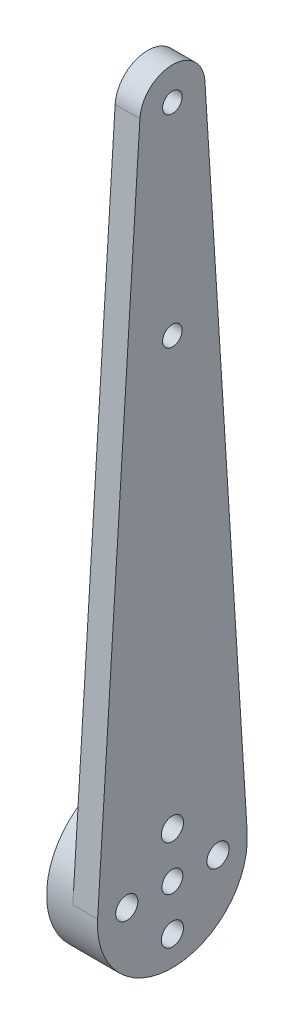
ISO-10303-21;
HEADER;
FILE_DESCRIPTION(('STEP AP214'),'2;1');
FILE_NAME('part.step','',(''),(''),'','','');
FILE_SCHEMA(('AUTOMOTIVE_DESIGN { 1 0 10303 214 1 1 1 1 }'));
ENDSEC;
DATA;
#1=APPLICATION_CONTEXT('core data for automotive mechanical design processes');
#2=APPLICATION_PROTOCOL_DEFINITION('international standard','automotive_design',2000,#1);
#3=PRODUCT_CONTEXT('',#1,'mechanical');
#4=PRODUCT('Part','Part','',(#3));
#5=PRODUCT_RELATED_PRODUCT_CATEGORY('part','',(#4));
#6=PRODUCT_DEFINITION_FORMATION('','',#4);
#7=PRODUCT_DEFINITION_CONTEXT('part definition',#1,'design');
#8=PRODUCT_DEFINITION('design','',#6,#7);
#9=PRODUCT_DEFINITION_SHAPE('','',#8);
#10=(LENGTH_UNIT() NAMED_UNIT(*) SI_UNIT(.MILLI.,.METRE.));
#11=(NAMED_UNIT(*) PLANE_ANGLE_UNIT() SI_UNIT($,.RADIAN.));
#12=(NAMED_UNIT(*) SI_UNIT($,.STERADIAN.) SOLID_ANGLE_UNIT());
#13=UNCERTAINTY_MEASURE_WITH_UNIT(LENGTH_MEASURE(1.E-05),#10,'distance_accuracy_value','');
#14=(GEOMETRIC_REPRESENTATION_CONTEXT(3) GLOBAL_UNCERTAINTY_ASSIGNED_CONTEXT((#13)) GLOBAL_UNIT_ASSIGNED_CONTEXT((#10,
#11,#12)) REPRESENTATION_CONTEXT('',''));
#15=CARTESIAN_POINT('',(0.,0.,0.));
#16=DIRECTION('',(0.,0.,1.));
#17=DIRECTION('',(1.,0.,0.));
#18=AXIS2_PLACEMENT_3D('',#15,#16,#17);
#19=CARTESIAN_POINT('',(3.80000000000004,0.,0.));
#20=DIRECTION('',(1.,0.,0.));
#21=DIRECTION('',(0.,1.,0.));
#22=AXIS2_PLACEMENT_3D('',#19,#20,#21);
#23=PLANE('',#22);
#24=CARTESIAN_POINT('',(3.8,72.5,0.));
#25=DIRECTION('',(1.,0.,0.));
#26=DIRECTION('',(0.,1.,0.));
#27=AXIS2_PLACEMENT_3D('',#24,#25,#26);
#28=CIRCLE('',#27,1.5);
#29=CARTESIAN_POINT('',(3.8,74.,0.));
#30=VERTEX_POINT('',#29);
#31=EDGE_CURVE('E38',#30,#30,#28,.T.);
#32=ORIENTED_EDGE('',*,*,#31,.F.);
#33=EDGE_LOOP('',(#32));
#34=FACE_BOUND('',#33,.T.);
#35=DIRECTION('',(0.,0.998026010327863,-0.0628019323671498));
#36=VECTOR('',#35,1.);
#37=CARTESIAN_POINT('',(3.80000000000004,0.722222222222215,11.4772991187704));
#38=LINE('',#37,#36);
#39=CARTESIAN_POINT('',(3.80000000000004,0.722222222222222,11.4772991187704));
#40=VERTEX_POINT('',#39);
#41=CARTESIAN_POINT('',(3.79999999999998,103.814009661836,4.99013005163932));
#42=VERTEX_POINT('',#41);
#43=EDGE_CURVE('E92',#40,#42,#38,.T.);
#44=ORIENTED_EDGE('',*,*,#43,.F.);
#45=CARTESIAN_POINT('',(3.80000000000004,0.,0.));
#46=DIRECTION('',(1.,0.,0.));
#47=DIRECTION('',(0.,1.,0.));
#48=AXIS2_PLACEMENT_3D('',#45,#46,#47);
#49=CIRCLE('',#48,11.5);
#50=CARTESIAN_POINT('',(3.80000000000002,0.722222222222222,-11.4772991187704));
#51=VERTEX_POINT('',#50);
#52=EDGE_CURVE('E85',#40,#51,#49,.T.);
#53=ORIENTED_EDGE('',*,*,#52,.T.);
#54=DIRECTION('',(0.,-0.998026010327863,-0.0628019323671498));
#55=VECTOR('',#54,1.);
#56=CARTESIAN_POINT('',(3.80000000000004,0.722222222222215,-11.4772991187704));
#57=LINE('',#56,#55);
#58=CARTESIAN_POINT('',(3.79999999999998,103.814009661836,-4.99013005163931));
#59=VERTEX_POINT('',#58);
#60=EDGE_CURVE('E43',#59,#51,#57,.T.);
#61=ORIENTED_EDGE('',*,*,#60,.F.);
#62=CARTESIAN_POINT('',(3.79999999999998,103.5,0.));
#63=DIRECTION('',(-1.,0.,0.));
#64=DIRECTION('',(0.,-1.,0.));
#65=AXIS2_PLACEMENT_3D('',#62,#63,#64);
#66=CIRCLE('',#65,5.);
#67=EDGE_CURVE('E51',#42,#59,#66,.T.);
#68=ORIENTED_EDGE('',*,*,#67,.F.);
#69=EDGE_LOOP('',(#44,#53,#61,#68));
#70=FACE_BOUND('',#69,.T.);
#71=CARTESIAN_POINT('',(3.80000000000004,7.,0.));
#72=DIRECTION('',(1.,0.,0.));
#73=DIRECTION('',(0.,1.,0.));
#74=AXIS2_PLACEMENT_3D('',#71,#72,#73);
#75=CIRCLE('',#74,1.7);
#76=CARTESIAN_POINT('',(3.80000000000004,8.7,0.));
#77=VERTEX_POINT('',#76);
#78=EDGE_CURVE('E95',#77,#77,#75,.F.);
#79=ORIENTED_EDGE('',*,*,#78,.T.);
#80=EDGE_LOOP('',(#79));
#81=FACE_BOUND('',#80,.T.);
#82=CARTESIAN_POINT('',(3.80000000000005,-7.,0.));
#83=DIRECTION('',(1.,0.,0.));
#84=DIRECTION('',(0.,1.,0.));
#85=AXIS2_PLACEMENT_3D('',#82,#83,#84);
#86=CIRCLE('',#85,1.7);
#87=CARTESIAN_POINT('',(3.80000000000005,-5.3,0.));
#88=VERTEX_POINT('',#87);
#89=EDGE_CURVE('E106',#88,#88,#86,.F.);
#90=ORIENTED_EDGE('',*,*,#89,.T.);
#91=EDGE_LOOP('',(#90));
#92=FACE_BOUND('',#91,.T.);
#93=CARTESIAN_POINT('',(3.80000000000004,0.,7.));
#94=DIRECTION('',(1.,0.,0.));
#95=DIRECTION('',(0.,1.,0.));
#96=AXIS2_PLACEMENT_3D('',#93,#94,#95);
#97=CIRCLE('',#96,1.7);
#98=CARTESIAN_POINT('',(3.80000000000004,1.69999999999997,7.));
#99=VERTEX_POINT('',#98);
#100=EDGE_CURVE('E109',#99,#99,#97,.F.);
#101=ORIENTED_EDGE('',*,*,#100,.T.);
#102=EDGE_LOOP('',(#101));
#103=FACE_BOUND('',#102,.T.);
#104=CARTESIAN_POINT('',(3.80000000000004,0.,-7.));
#105=DIRECTION('',(1.,0.,0.));
#106=DIRECTION('',(0.,1.,0.));
#107=AXIS2_PLACEMENT_3D('',#104,#105,#106);
#108=CIRCLE('',#107,1.7);
#109=CARTESIAN_POINT('',(3.80000000000004,1.70000000000007,-7.));
#110=VERTEX_POINT('',#109);
#111=EDGE_CURVE('E101',#110,#110,#108,.F.);
#112=ORIENTED_EDGE('',*,*,#111,.T.);
#113=EDGE_LOOP('',(#112));
#114=FACE_BOUND('',#113,.T.);
#115=CARTESIAN_POINT('',(3.80000000000004,0.,0.));
#116=DIRECTION('',(1.,0.,0.));
#117=DIRECTION('',(0.,1.,0.));
#118=AXIS2_PLACEMENT_3D('',#115,#116,#117);
#119=CIRCLE('',#118,1.6);
#120=CARTESIAN_POINT('',(3.80000000000004,1.6,0.));
#121=VERTEX_POINT('',#120);
#122=EDGE_CURVE('E94',#121,#121,#119,.T.);
#123=ORIENTED_EDGE('',*,*,#122,.F.);
#124=EDGE_LOOP('',(#123));
#125=FACE_BOUND('',#124,.T.);
#126=CARTESIAN_POINT('',(3.79999999999998,103.5,0.));
#127=DIRECTION('',(-1.,0.,0.));
#128=DIRECTION('',(0.,-1.,0.));
#129=AXIS2_PLACEMENT_3D('',#126,#127,#128);
#130=CIRCLE('',#129,1.5);
#131=CARTESIAN_POINT('',(3.79999999999998,102.,0.));
#132=VERTEX_POINT('',#131);
#133=EDGE_CURVE('E11',#132,#132,#130,.T.);
#134=ORIENTED_EDGE('',*,*,#133,.T.);
#135=EDGE_LOOP('',(#134));
#136=FACE_BOUND('',#135,.T.);
#137=ADVANCED_FACE('F34',(#34,#70,#81,#92,#103,#114,#125,#136),#23,.T.);
#138=CARTESIAN_POINT('',(16.,0.,0.));
#139=DIRECTION('',(-1.,0.,0.));
#140=DIRECTION('',(0.,0.,1.));
#141=AXIS2_PLACEMENT_3D('',#138,#139,#140);
#142=CYLINDRICAL_SURFACE('',#141,1.6);
#143=CARTESIAN_POINT('',(-2.,0.,0.));
#144=DIRECTION('',(1.,0.,0.));
#145=DIRECTION('',(0.,0.,-1.));
#146=AXIS2_PLACEMENT_3D('',#143,#144,#145);
#147=CIRCLE('',#146,1.6);
#148=CARTESIAN_POINT('',(-2.,0.,-1.6));
#149=VERTEX_POINT('',#148);
#150=EDGE_CURVE('E132',#149,#149,#147,.T.);
#151=ORIENTED_EDGE('',*,*,#150,.F.);
#152=EDGE_LOOP('',(#151));
#153=FACE_BOUND('',#152,.T.);
#154=ORIENTED_EDGE('',*,*,#122,.T.);
#155=EDGE_LOOP('',(#154));
#156=FACE_BOUND('',#155,.T.);
#157=ADVANCED_FACE('F36',(#153,#156),#142,.F.);
#158=CARTESIAN_POINT('',(16.,0.722222222222222,11.4772991187704));
#159=DIRECTION('',(0.,-0.0628019323671498,-0.998026010327863));
#160=DIRECTION('',(0.,0.998026010327863,-0.0628019323671498));
#161=AXIS2_PLACEMENT_3D('',#158,#159,#160);
#162=PLANE('',#161);
#163=DIRECTION('',(-1.,0.,0.));
#164=VECTOR('',#163,1.);
#165=CARTESIAN_POINT('',(16.,0.722222222222222,11.4772991187704));
#166=LINE('',#165,#164);
#167=CARTESIAN_POINT('',(0.,0.722222222222222,11.4772991187704));
#168=VERTEX_POINT('',#167);
#169=EDGE_CURVE('E89',#40,#168,#166,.T.);
#170=ORIENTED_EDGE('',*,*,#169,.F.);
#171=ORIENTED_EDGE('',*,*,#43,.T.);
#172=DIRECTION('',(-1.,0.,0.));
#173=VECTOR('',#172,1.);
#174=CARTESIAN_POINT('',(16.,103.814009661836,4.99013005163932));
#175=LINE('',#174,#173);
#176=CARTESIAN_POINT('',(0.,103.814009661836,4.99013005163932));
#177=VERTEX_POINT('',#176);
#178=EDGE_CURVE('E113',#42,#177,#175,.T.);
#179=ORIENTED_EDGE('',*,*,#178,.T.);
#180=DIRECTION('',(0.,-0.998026010327863,0.0628019323671498));
#181=VECTOR('',#180,1.);
#182=CARTESIAN_POINT('',(0.,0.722222222222222,11.4772991187704));
#183=LINE('',#182,#181);
#184=EDGE_CURVE('E117',#177,#168,#183,.T.);
#185=ORIENTED_EDGE('',*,*,#184,.T.);
#186=EDGE_LOOP('',(#170,#171,#179,#185));
#187=FACE_BOUND('',#186,.T.);
#188=ADVANCED_FACE('F152',(#187),#162,.F.);
#189=CARTESIAN_POINT('',(16.,0.,0.));
#190=DIRECTION('',(-1.,0.,0.));
#191=DIRECTION('',(0.,0.,1.));
#192=AXIS2_PLACEMENT_3D('',#189,#190,#191);
#193=CYLINDRICAL_SURFACE('',#192,11.5);
#194=CARTESIAN_POINT('',(-4.,0.,0.));
#195=DIRECTION('',(1.,0.,0.));
#196=DIRECTION('',(0.,0.,-1.));
#197=AXIS2_PLACEMENT_3D('',#194,#195,#196);
#198=CIRCLE('',#197,11.5);
#199=CARTESIAN_POINT('',(-4.,0.,-11.5));
#200=VERTEX_POINT('',#199);
#201=EDGE_CURVE('E130',#200,#200,#198,.T.);
#202=ORIENTED_EDGE('',*,*,#201,.T.);
#203=EDGE_LOOP('',(#202));
#204=FACE_BOUND('',#203,.T.);
#205=ORIENTED_EDGE('',*,*,#52,.F.);
#206=ORIENTED_EDGE('',*,*,#169,.T.);
#207=CARTESIAN_POINT('',(0.,0.,0.));
#208=DIRECTION('',(1.,0.,0.));
#209=DIRECTION('',(0.,0.,-1.));
#210=AXIS2_PLACEMENT_3D('',#207,#208,#209);
#211=CIRCLE('',#210,11.5);
#212=CARTESIAN_POINT('',(0.,0.722222222222222,-11.4772991187704));
#213=VERTEX_POINT('',#212);
#214=EDGE_CURVE('E87',#213,#168,#211,.T.);
#215=ORIENTED_EDGE('',*,*,#214,.F.);
#216=DIRECTION('',(-1.,0.,0.));
#217=VECTOR('',#216,1.);
#218=CARTESIAN_POINT('',(16.,0.722222222222222,-11.4772991187704));
#219=LINE('',#218,#217);
#220=EDGE_CURVE('E77',#51,#213,#219,.T.);
#221=ORIENTED_EDGE('',*,*,#220,.F.);
#222=EDGE_LOOP('',(#205,#206,#215,#221));
#223=FACE_BOUND('',#222,.T.);
#224=ADVANCED_FACE('F84',(#204,#223),#193,.T.);
#225=CARTESIAN_POINT('',(16.,0.722222222222222,-11.4772991187704));
#226=DIRECTION('',(0.,-0.0628019323671497,0.998026010327863));
#227=DIRECTION('',(0.,-0.998026010327863,-0.0628019323671498));
#228=AXIS2_PLACEMENT_3D('',#225,#226,#227);
#229=PLANE('',#228);
#230=ORIENTED_EDGE('',*,*,#60,.T.);
#231=ORIENTED_EDGE('',*,*,#220,.T.);
#232=DIRECTION('',(0.,0.998026010327863,0.0628019323671498));
#233=VECTOR('',#232,1.);
#234=CARTESIAN_POINT('',(0.,0.722222222222222,-11.4772991187704));
#235=LINE('',#234,#233);
#236=CARTESIAN_POINT('',(0.,103.814009661836,-4.99013005163932));
#237=VERTEX_POINT('',#236);
#238=EDGE_CURVE('E115',#213,#237,#235,.T.);
#239=ORIENTED_EDGE('',*,*,#238,.T.);
#240=DIRECTION('',(-1.,0.,0.));
#241=VECTOR('',#240,1.);
#242=CARTESIAN_POINT('',(16.,103.814009661836,-4.99013005163932));
#243=LINE('',#242,#241);
#244=EDGE_CURVE('E79',#59,#237,#243,.T.);
#245=ORIENTED_EDGE('',*,*,#244,.F.);
#246=EDGE_LOOP('',(#230,#231,#239,#245));
#247=FACE_BOUND('',#246,.T.);
#248=ADVANCED_FACE('F75',(#247),#229,.F.);
#249=CARTESIAN_POINT('',(16.,7.,0.));
#250=DIRECTION('',(1.,0.,0.));
#251=DIRECTION('',(0.,0.,-1.));
#252=AXIS2_PLACEMENT_3D('',#249,#250,#251);
#253=CYLINDRICAL_SURFACE('',#252,1.7);
#254=CARTESIAN_POINT('',(-2.,7.,0.));
#255=DIRECTION('',(1.,0.,0.));
#256=DIRECTION('',(0.,0.,-1.));
#257=AXIS2_PLACEMENT_3D('',#254,#255,#256);
#258=CIRCLE('',#257,1.7);
#259=CARTESIAN_POINT('',(-2.,7.,-1.7));
#260=VERTEX_POINT('',#259);
#261=EDGE_CURVE('E140',#260,#260,#258,.T.);
#262=ORIENTED_EDGE('',*,*,#261,.F.);
#263=EDGE_LOOP('',(#262));
#264=FACE_BOUND('',#263,.T.);
#265=ORIENTED_EDGE('',*,*,#78,.F.);
#266=EDGE_LOOP('',(#265));
#267=FACE_BOUND('',#266,.T.);
#268=ADVANCED_FACE('F207',(#264,#267),#253,.F.);
#269=CARTESIAN_POINT('',(16.,0.,-7.));
#270=DIRECTION('',(1.,0.,0.));
#271=DIRECTION('',(0.,-1.,0.));
#272=AXIS2_PLACEMENT_3D('',#269,#270,#271);
#273=CYLINDRICAL_SURFACE('',#272,1.7);
#274=CARTESIAN_POINT('',(-2.,0.,-7.));
#275=DIRECTION('',(1.,0.,0.));
#276=DIRECTION('',(0.,-1.,0.));
#277=AXIS2_PLACEMENT_3D('',#274,#275,#276);
#278=CIRCLE('',#277,1.7);
#279=CARTESIAN_POINT('',(-2.,-1.69999999999992,-7.00000000000002));
#280=VERTEX_POINT('',#279);
#281=EDGE_CURVE('E141',#280,#280,#278,.T.);
#282=ORIENTED_EDGE('',*,*,#281,.F.);
#283=EDGE_LOOP('',(#282));
#284=FACE_BOUND('',#283,.T.);
#285=ORIENTED_EDGE('',*,*,#111,.F.);
#286=EDGE_LOOP('',(#285));
#287=FACE_BOUND('',#286,.T.);
#288=ADVANCED_FACE('F211',(#284,#287),#273,.F.);
#289=CARTESIAN_POINT('',(16.,-7.,0.));
#290=DIRECTION('',(1.,0.,0.));
#291=DIRECTION('',(0.,0.,1.));
#292=AXIS2_PLACEMENT_3D('',#289,#290,#291);
#293=CYLINDRICAL_SURFACE('',#292,1.7);
#294=CARTESIAN_POINT('',(-2.,-7.,0.));
#295=DIRECTION('',(1.,0.,0.));
#296=DIRECTION('',(0.,0.,1.));
#297=AXIS2_PLACEMENT_3D('',#294,#295,#296);
#298=CIRCLE('',#297,1.7);
#299=CARTESIAN_POINT('',(-2.,-7.,1.7));
#300=VERTEX_POINT('',#299);
#301=EDGE_CURVE('E144',#300,#300,#298,.T.);
#302=ORIENTED_EDGE('',*,*,#301,.F.);
#303=EDGE_LOOP('',(#302));
#304=FACE_BOUND('',#303,.T.);
#305=ORIENTED_EDGE('',*,*,#89,.F.);
#306=EDGE_LOOP('',(#305));
#307=FACE_BOUND('',#306,.T.);
#308=ADVANCED_FACE('F217',(#304,#307),#293,.F.);
#309=CARTESIAN_POINT('',(16.,0.,7.));
#310=DIRECTION('',(1.,0.,0.));
#311=DIRECTION('',(0.,1.,0.));
#312=AXIS2_PLACEMENT_3D('',#309,#310,#311);
#313=CYLINDRICAL_SURFACE('',#312,1.7);
#314=CARTESIAN_POINT('',(-2.,0.,7.));
#315=DIRECTION('',(1.,0.,0.));
#316=DIRECTION('',(0.,1.,0.));
#317=AXIS2_PLACEMENT_3D('',#314,#315,#316);
#318=CIRCLE('',#317,1.7);
#319=CARTESIAN_POINT('',(-2.,1.69999999999997,7.00000000000001));
#320=VERTEX_POINT('',#319);
#321=EDGE_CURVE('E147',#320,#320,#318,.T.);
#322=ORIENTED_EDGE('',*,*,#321,.F.);
#323=EDGE_LOOP('',(#322));
#324=FACE_BOUND('',#323,.T.);
#325=ORIENTED_EDGE('',*,*,#100,.F.);
#326=EDGE_LOOP('',(#325));
#327=FACE_BOUND('',#326,.T.);
#328=ADVANCED_FACE('F198',(#324,#327),#313,.F.);
#329=CARTESIAN_POINT('',(16.,103.5,0.));
#330=DIRECTION('',(-1.,0.,0.));
#331=DIRECTION('',(0.,0.,1.));
#332=AXIS2_PLACEMENT_3D('',#329,#330,#331);
#333=CYLINDRICAL_SURFACE('',#332,5.);
#334=ORIENTED_EDGE('',*,*,#67,.T.);
#335=ORIENTED_EDGE('',*,*,#244,.T.);
#336=CARTESIAN_POINT('',(0.,103.5,0.));
#337=DIRECTION('',(1.,0.,0.));
#338=DIRECTION('',(0.,0.,-1.));
#339=AXIS2_PLACEMENT_3D('',#336,#337,#338);
#340=CIRCLE('',#339,5.);
#341=EDGE_CURVE('E121',#237,#177,#340,.T.);
#342=ORIENTED_EDGE('',*,*,#341,.T.);
#343=ORIENTED_EDGE('',*,*,#178,.F.);
#344=EDGE_LOOP('',(#334,#335,#342,#343));
#345=FACE_BOUND('',#344,.T.);
#346=ADVANCED_FACE('F154',(#345),#333,.T.);
#347=CARTESIAN_POINT('',(16.,103.5,0.));
#348=DIRECTION('',(-1.,0.,0.));
#349=DIRECTION('',(0.,0.,1.));
#350=AXIS2_PLACEMENT_3D('',#347,#348,#349);
#351=CYLINDRICAL_SURFACE('',#350,1.5);
#352=ORIENTED_EDGE('',*,*,#133,.F.);
#353=EDGE_LOOP('',(#352));
#354=FACE_BOUND('',#353,.T.);
#355=CARTESIAN_POINT('',(0.,103.5,0.));
#356=DIRECTION('',(1.,0.,0.));
#357=DIRECTION('',(0.,0.,-1.));
#358=AXIS2_PLACEMENT_3D('',#355,#356,#357);
#359=CIRCLE('',#358,1.5);
#360=CARTESIAN_POINT('',(0.,103.5,-1.5));
#361=VERTEX_POINT('',#360);
#362=EDGE_CURVE('E127',#361,#361,#359,.T.);
#363=ORIENTED_EDGE('',*,*,#362,.F.);
#364=EDGE_LOOP('',(#363));
#365=FACE_BOUND('',#364,.T.);
#366=ADVANCED_FACE('F169',(#354,#365),#351,.F.);
#367=CARTESIAN_POINT('',(-4.,0.,0.));
#368=DIRECTION('',(1.,0.,0.));
#369=DIRECTION('',(0.,0.,-1.));
#370=AXIS2_PLACEMENT_3D('',#367,#368,#369);
#371=CYLINDRICAL_SURFACE('',#370,10.25);
#372=CARTESIAN_POINT('',(-4.,0.,0.));
#373=DIRECTION('',(1.,0.,0.));
#374=DIRECTION('',(0.,0.,-1.));
#375=AXIS2_PLACEMENT_3D('',#372,#373,#374);
#376=CIRCLE('',#375,10.25);
#377=CARTESIAN_POINT('',(-4.,0.,-10.25));
#378=VERTEX_POINT('',#377);
#379=EDGE_CURVE('E133',#378,#378,#376,.T.);
#380=ORIENTED_EDGE('',*,*,#379,.F.);
#381=EDGE_LOOP('',(#380));
#382=FACE_BOUND('',#381,.T.);
#383=CARTESIAN_POINT('',(-2.,0.,0.));
#384=DIRECTION('',(1.,0.,0.));
#385=DIRECTION('',(0.,0.,-1.));
#386=AXIS2_PLACEMENT_3D('',#383,#384,#385);
#387=CIRCLE('',#386,10.25);
#388=CARTESIAN_POINT('',(-2.,0.,-10.25));
#389=VERTEX_POINT('',#388);
#390=EDGE_CURVE('E98',#389,#389,#387,.F.);
#391=ORIENTED_EDGE('',*,*,#390,.F.);
#392=EDGE_LOOP('',(#391));
#393=FACE_BOUND('',#392,.T.);
#394=ADVANCED_FACE('F159',(#382,#393),#371,.F.);
#395=CARTESIAN_POINT('',(0.,0.,0.));
#396=DIRECTION('',(1.,0.,0.));
#397=DIRECTION('',(0.,0.,-1.));
#398=AXIS2_PLACEMENT_3D('',#395,#396,#397);
#399=PLANE('',#398);
#400=CARTESIAN_POINT('',(0.,72.5,0.));
#401=DIRECTION('',(1.,0.,0.));
#402=DIRECTION('',(0.,0.,-1.));
#403=AXIS2_PLACEMENT_3D('',#400,#401,#402);
#404=CIRCLE('',#403,1.5);
#405=CARTESIAN_POINT('',(0.,72.5,-1.5));
#406=VERTEX_POINT('',#405);
#407=EDGE_CURVE('E112',#406,#406,#404,.T.);
#408=ORIENTED_EDGE('',*,*,#407,.T.);
#409=EDGE_LOOP('',(#408));
#410=FACE_BOUND('',#409,.T.);
#411=ORIENTED_EDGE('',*,*,#362,.T.);
#412=EDGE_LOOP('',(#411));
#413=FACE_BOUND('',#412,.T.);
#414=ORIENTED_EDGE('',*,*,#238,.F.);
#415=ORIENTED_EDGE('',*,*,#214,.T.);
#416=ORIENTED_EDGE('',*,*,#184,.F.);
#417=ORIENTED_EDGE('',*,*,#341,.F.);
#418=EDGE_LOOP('',(#414,#415,#416,#417));
#419=FACE_BOUND('',#418,.T.);
#420=ADVANCED_FACE('F156',(#410,#413,#419),#399,.F.);
#421=CARTESIAN_POINT('',(-4.,0.,0.));
#422=DIRECTION('',(1.,0.,0.));
#423=DIRECTION('',(0.,0.,-1.));
#424=AXIS2_PLACEMENT_3D('',#421,#422,#423);
#425=PLANE('',#424);
#426=ORIENTED_EDGE('',*,*,#379,.T.);
#427=EDGE_LOOP('',(#426));
#428=FACE_BOUND('',#427,.T.);
#429=ORIENTED_EDGE('',*,*,#201,.F.);
#430=EDGE_LOOP('',(#429));
#431=FACE_BOUND('',#430,.T.);
#432=ADVANCED_FACE('F158',(#428,#431),#425,.F.);
#433=CARTESIAN_POINT('',(-2.,0.,0.));
#434=DIRECTION('',(1.,0.,0.));
#435=DIRECTION('',(0.,0.,-1.));
#436=AXIS2_PLACEMENT_3D('',#433,#434,#435);
#437=PLANE('',#436);
#438=ORIENTED_EDGE('',*,*,#321,.T.);
#439=EDGE_LOOP('',(#438));
#440=FACE_BOUND('',#439,.T.);
#441=ORIENTED_EDGE('',*,*,#301,.T.);
#442=EDGE_LOOP('',(#441));
#443=FACE_BOUND('',#442,.T.);
#444=ORIENTED_EDGE('',*,*,#281,.T.);
#445=EDGE_LOOP('',(#444));
#446=FACE_BOUND('',#445,.T.);
#447=ORIENTED_EDGE('',*,*,#261,.T.);
#448=EDGE_LOOP('',(#447));
#449=FACE_BOUND('',#448,.T.);
#450=ORIENTED_EDGE('',*,*,#150,.T.);
#451=EDGE_LOOP('',(#450));
#452=FACE_BOUND('',#451,.T.);
#453=ORIENTED_EDGE('',*,*,#390,.T.);
#454=EDGE_LOOP('',(#453));
#455=FACE_BOUND('',#454,.T.);
#456=ADVANCED_FACE('F166',(#440,#443,#446,#449,#452,#455),#437,.F.);
#457=CARTESIAN_POINT('',(16.,72.5,0.));
#458=DIRECTION('',(1.,0.,0.));
#459=DIRECTION('',(0.,0.,-1.));
#460=AXIS2_PLACEMENT_3D('',#457,#458,#459);
#461=CYLINDRICAL_SURFACE('',#460,1.5);
#462=ORIENTED_EDGE('',*,*,#31,.T.);
#463=EDGE_LOOP('',(#462));
#464=FACE_BOUND('',#463,.T.);
#465=ORIENTED_EDGE('',*,*,#407,.F.);
#466=EDGE_LOOP('',(#465));
#467=FACE_BOUND('',#466,.T.);
#468=ADVANCED_FACE('F183',(#464,#467),#461,.F.);
#469=CLOSED_SHELL('',(#137,#157,#188,#224,#248,#268,#288,#308,#328,#346,#366,#394,#420,#432,
#456,#468));
#470=MANIFOLD_SOLID_BREP('B2',#469);
#471=ADVANCED_BREP_SHAPE_REPRESENTATION('',(#18,#470),#14);
#472=SHAPE_DEFINITION_REPRESENTATION(#9,#471);
ENDSEC;
END-ISO-10303-21;
